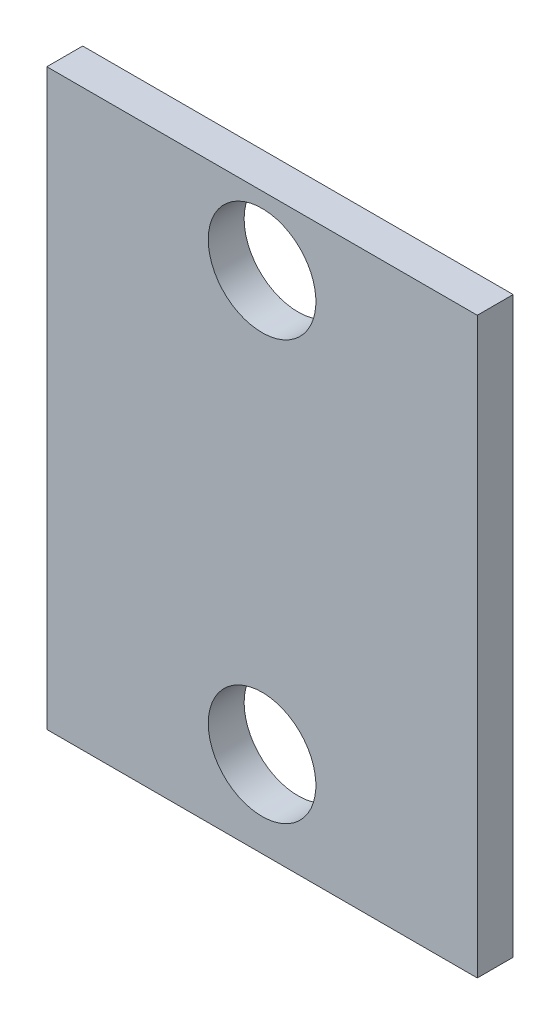
ISO-10303-21;
HEADER;
FILE_DESCRIPTION(('STEP AP214'),'2;1');
FILE_NAME('part.step','',(''),(''),'','','');
FILE_SCHEMA(('AUTOMOTIVE_DESIGN { 1 0 10303 214 1 1 1 1 }'));
ENDSEC;
DATA;
#1=APPLICATION_CONTEXT('core data for automotive mechanical design processes');
#2=APPLICATION_PROTOCOL_DEFINITION('international standard','automotive_design',2000,#1);
#3=PRODUCT_CONTEXT('',#1,'mechanical');
#4=PRODUCT('Part','Part','',(#3));
#5=PRODUCT_RELATED_PRODUCT_CATEGORY('part','',(#4));
#6=PRODUCT_DEFINITION_FORMATION('','',#4);
#7=PRODUCT_DEFINITION_CONTEXT('part definition',#1,'design');
#8=PRODUCT_DEFINITION('design','',#6,#7);
#9=PRODUCT_DEFINITION_SHAPE('','',#8);
#10=(LENGTH_UNIT() NAMED_UNIT(*) SI_UNIT(.MILLI.,.METRE.));
#11=(NAMED_UNIT(*) PLANE_ANGLE_UNIT() SI_UNIT($,.RADIAN.));
#12=(NAMED_UNIT(*) SI_UNIT($,.STERADIAN.) SOLID_ANGLE_UNIT());
#13=UNCERTAINTY_MEASURE_WITH_UNIT(LENGTH_MEASURE(1.E-05),#10,'distance_accuracy_value','');
#14=(GEOMETRIC_REPRESENTATION_CONTEXT(3) GLOBAL_UNCERTAINTY_ASSIGNED_CONTEXT((#13)) GLOBAL_UNIT_ASSIGNED_CONTEXT((#10,
#11,#12)) REPRESENTATION_CONTEXT('',''));
#15=CARTESIAN_POINT('',(0.,0.,0.));
#16=DIRECTION('',(0.,0.,1.));
#17=DIRECTION('',(1.,0.,0.));
#18=AXIS2_PLACEMENT_3D('',#15,#16,#17);
#19=CARTESIAN_POINT('',(0.,0.,1.5875));
#20=DIRECTION('',(1.,0.,0.));
#21=DIRECTION('',(0.,1.,0.));
#22=AXIS2_PLACEMENT_3D('',#19,#20,#21);
#23=PLANE('',#22);
#24=DIRECTION('',(0.,-1.,0.));
#25=VECTOR('',#24,1.);
#26=CARTESIAN_POINT('',(0.,0.,0.));
#27=LINE('',#26,#25);
#28=CARTESIAN_POINT('',(0.,0.,0.));
#29=VERTEX_POINT('',#28);
#30=CARTESIAN_POINT('',(0.,-25.4,0.));
#31=VERTEX_POINT('',#30);
#32=EDGE_CURVE('E107',#29,#31,#27,.T.);
#33=ORIENTED_EDGE('',*,*,#32,.T.);
#34=DIRECTION('',(0.,0.,-1.));
#35=VECTOR('',#34,1.);
#36=CARTESIAN_POINT('',(0.,-25.4,1.5875));
#37=LINE('',#36,#35);
#38=CARTESIAN_POINT('',(0.,-25.4,1.5875));
#39=VERTEX_POINT('',#38);
#40=EDGE_CURVE('E11',#39,#31,#37,.T.);
#41=ORIENTED_EDGE('',*,*,#40,.F.);
#42=DIRECTION('',(0.,-1.,0.));
#43=VECTOR('',#42,1.);
#44=CARTESIAN_POINT('',(0.,0.,1.5875));
#45=LINE('',#44,#43);
#46=CARTESIAN_POINT('',(0.,0.,1.5875));
#47=VERTEX_POINT('',#46);
#48=EDGE_CURVE('E91',#47,#39,#45,.T.);
#49=ORIENTED_EDGE('',*,*,#48,.F.);
#50=DIRECTION('',(0.,0.,-1.));
#51=VECTOR('',#50,1.);
#52=CARTESIAN_POINT('',(0.,0.,1.5875));
#53=LINE('',#52,#51);
#54=EDGE_CURVE('E103',#47,#29,#53,.T.);
#55=ORIENTED_EDGE('',*,*,#54,.T.);
#56=EDGE_LOOP('',(#33,#41,#49,#55));
#57=FACE_BOUND('',#56,.T.);
#58=ADVANCED_FACE('F39',(#57),#23,.F.);
#59=CARTESIAN_POINT('',(0.,-25.4,1.5875));
#60=DIRECTION('',(0.,1.,0.));
#61=DIRECTION('',(0.,0.,1.));
#62=AXIS2_PLACEMENT_3D('',#59,#60,#61);
#63=PLANE('',#62);
#64=DIRECTION('',(1.,0.,0.));
#65=VECTOR('',#64,1.);
#66=CARTESIAN_POINT('',(0.,-25.4,0.));
#67=LINE('',#66,#65);
#68=CARTESIAN_POINT('',(19.05,-25.4,0.));
#69=VERTEX_POINT('',#68);
#70=EDGE_CURVE('E96',#31,#69,#67,.T.);
#71=ORIENTED_EDGE('',*,*,#70,.T.);
#72=DIRECTION('',(0.,0.,-1.));
#73=VECTOR('',#72,1.);
#74=CARTESIAN_POINT('',(19.05,-25.4,1.5875));
#75=LINE('',#74,#73);
#76=CARTESIAN_POINT('',(19.05,-25.4,1.5875));
#77=VERTEX_POINT('',#76);
#78=EDGE_CURVE('E48',#77,#69,#75,.T.);
#79=ORIENTED_EDGE('',*,*,#78,.F.);
#80=DIRECTION('',(1.,0.,0.));
#81=VECTOR('',#80,1.);
#82=CARTESIAN_POINT('',(0.,-25.4,1.5875));
#83=LINE('',#82,#81);
#84=EDGE_CURVE('E86',#39,#77,#83,.T.);
#85=ORIENTED_EDGE('',*,*,#84,.F.);
#86=ORIENTED_EDGE('',*,*,#40,.T.);
#87=EDGE_LOOP('',(#71,#79,#85,#86));
#88=FACE_BOUND('',#87,.T.);
#89=ADVANCED_FACE('F95',(#88),#63,.F.);
#90=CARTESIAN_POINT('',(19.05,0.,1.5875));
#91=DIRECTION('',(-1.,0.,0.));
#92=DIRECTION('',(0.,-1.,0.));
#93=AXIS2_PLACEMENT_3D('',#90,#91,#92);
#94=PLANE('',#93);
#95=DIRECTION('',(0.,1.,0.));
#96=VECTOR('',#95,1.);
#97=CARTESIAN_POINT('',(19.05,0.,0.));
#98=LINE('',#97,#96);
#99=CARTESIAN_POINT('',(19.05,0.,0.));
#100=VERTEX_POINT('',#99);
#101=EDGE_CURVE('E73',#69,#100,#98,.T.);
#102=ORIENTED_EDGE('',*,*,#101,.T.);
#103=DIRECTION('',(0.,0.,-1.));
#104=VECTOR('',#103,1.);
#105=CARTESIAN_POINT('',(19.05,0.,1.5875));
#106=LINE('',#105,#104);
#107=CARTESIAN_POINT('',(19.05,0.,1.5875));
#108=VERTEX_POINT('',#107);
#109=EDGE_CURVE('E98',#108,#100,#106,.T.);
#110=ORIENTED_EDGE('',*,*,#109,.F.);
#111=DIRECTION('',(0.,1.,0.));
#112=VECTOR('',#111,1.);
#113=CARTESIAN_POINT('',(19.05,0.,1.5875));
#114=LINE('',#113,#112);
#115=EDGE_CURVE('E89',#77,#108,#114,.T.);
#116=ORIENTED_EDGE('',*,*,#115,.F.);
#117=ORIENTED_EDGE('',*,*,#78,.T.);
#118=EDGE_LOOP('',(#102,#110,#116,#117));
#119=FACE_BOUND('',#118,.T.);
#120=ADVANCED_FACE('F99',(#119),#94,.F.);
#121=CARTESIAN_POINT('',(0.,0.,1.5875));
#122=DIRECTION('',(0.,-1.,0.));
#123=DIRECTION('',(0.,0.,-1.));
#124=AXIS2_PLACEMENT_3D('',#121,#122,#123);
#125=PLANE('',#124);
#126=DIRECTION('',(-1.,0.,0.));
#127=VECTOR('',#126,1.);
#128=CARTESIAN_POINT('',(0.,0.,0.));
#129=LINE('',#128,#127);
#130=EDGE_CURVE('E79',#100,#29,#129,.T.);
#131=ORIENTED_EDGE('',*,*,#130,.T.);
#132=ORIENTED_EDGE('',*,*,#54,.F.);
#133=DIRECTION('',(-1.,0.,0.));
#134=VECTOR('',#133,1.);
#135=CARTESIAN_POINT('',(0.,0.,1.5875));
#136=LINE('',#135,#134);
#137=EDGE_CURVE('E56',#108,#47,#136,.T.);
#138=ORIENTED_EDGE('',*,*,#137,.F.);
#139=ORIENTED_EDGE('',*,*,#109,.T.);
#140=EDGE_LOOP('',(#131,#132,#138,#139));
#141=FACE_BOUND('',#140,.T.);
#142=ADVANCED_FACE('F121',(#141),#125,.F.);
#143=CARTESIAN_POINT('',(0.,0.,1.5875));
#144=DIRECTION('',(0.,0.,1.));
#145=DIRECTION('',(1.,0.,0.));
#146=AXIS2_PLACEMENT_3D('',#143,#144,#145);
#147=PLANE('',#146);
#148=CARTESIAN_POINT('',(9.525,-3.048,1.5875));
#149=DIRECTION('',(0.,0.,-1.));
#150=DIRECTION('',(-1.,0.,0.));
#151=AXIS2_PLACEMENT_3D('',#148,#149,#150);
#152=CIRCLE('',#151,2.38125);
#153=CARTESIAN_POINT('',(7.14375,-3.048,1.5875));
#154=VERTEX_POINT('',#153);
#155=EDGE_CURVE('E135',#154,#154,#152,.T.);
#156=ORIENTED_EDGE('',*,*,#155,.T.);
#157=EDGE_LOOP('',(#156));
#158=FACE_BOUND('',#157,.T.);
#159=CARTESIAN_POINT('',(9.525,-21.59,1.5875));
#160=DIRECTION('',(0.,0.,-1.));
#161=DIRECTION('',(-1.,0.,0.));
#162=AXIS2_PLACEMENT_3D('',#159,#160,#161);
#163=CIRCLE('',#162,2.38125);
#164=CARTESIAN_POINT('',(7.14375,-21.59,1.5875));
#165=VERTEX_POINT('',#164);
#166=EDGE_CURVE('E111',#165,#165,#163,.T.);
#167=ORIENTED_EDGE('',*,*,#166,.T.);
#168=EDGE_LOOP('',(#167));
#169=FACE_BOUND('',#168,.T.);
#170=ORIENTED_EDGE('',*,*,#48,.T.);
#171=ORIENTED_EDGE('',*,*,#84,.T.);
#172=ORIENTED_EDGE('',*,*,#115,.T.);
#173=ORIENTED_EDGE('',*,*,#137,.T.);
#174=EDGE_LOOP('',(#170,#171,#172,#173));
#175=FACE_BOUND('',#174,.T.);
#176=ADVANCED_FACE('F87',(#158,#169,#175),#147,.T.);
#177=CARTESIAN_POINT('',(0.,0.,0.));
#178=DIRECTION('',(0.,0.,1.));
#179=DIRECTION('',(1.,0.,0.));
#180=AXIS2_PLACEMENT_3D('',#177,#178,#179);
#181=PLANE('',#180);
#182=CARTESIAN_POINT('',(9.525,-3.048,0.));
#183=DIRECTION('',(0.,0.,-1.));
#184=DIRECTION('',(-1.,0.,0.));
#185=AXIS2_PLACEMENT_3D('',#182,#183,#184);
#186=CIRCLE('',#185,2.38124999999999);
#187=CARTESIAN_POINT('',(7.14375000000001,-3.048,0.));
#188=VERTEX_POINT('',#187);
#189=EDGE_CURVE('E139',#188,#188,#186,.T.);
#190=ORIENTED_EDGE('',*,*,#189,.F.);
#191=EDGE_LOOP('',(#190));
#192=FACE_BOUND('',#191,.T.);
#193=CARTESIAN_POINT('',(9.525,-21.59,0.));
#194=DIRECTION('',(0.,0.,-1.));
#195=DIRECTION('',(-1.,0.,0.));
#196=AXIS2_PLACEMENT_3D('',#193,#194,#195);
#197=CIRCLE('',#196,2.38124999999999);
#198=CARTESIAN_POINT('',(7.14375000000002,-21.59,0.));
#199=VERTEX_POINT('',#198);
#200=EDGE_CURVE('E131',#199,#199,#197,.T.);
#201=ORIENTED_EDGE('',*,*,#200,.F.);
#202=EDGE_LOOP('',(#201));
#203=FACE_BOUND('',#202,.T.);
#204=ORIENTED_EDGE('',*,*,#32,.F.);
#205=ORIENTED_EDGE('',*,*,#130,.F.);
#206=ORIENTED_EDGE('',*,*,#101,.F.);
#207=ORIENTED_EDGE('',*,*,#70,.F.);
#208=EDGE_LOOP('',(#204,#205,#206,#207));
#209=FACE_BOUND('',#208,.T.);
#210=ADVANCED_FACE('F124',(#192,#203,#209),#181,.F.);
#211=CARTESIAN_POINT('',(9.525,-21.59,0.));
#212=DIRECTION('',(0.,0.,-1.));
#213=DIRECTION('',(-1.,0.,0.));
#214=AXIS2_PLACEMENT_3D('',#211,#212,#213);
#215=CYLINDRICAL_SURFACE('',#214,2.38124999999999);
#216=ORIENTED_EDGE('',*,*,#166,.F.);
#217=EDGE_LOOP('',(#216));
#218=FACE_BOUND('',#217,.T.);
#219=ORIENTED_EDGE('',*,*,#200,.T.);
#220=EDGE_LOOP('',(#219));
#221=FACE_BOUND('',#220,.T.);
#222=ADVANCED_FACE('F148',(#218,#221),#215,.F.);
#223=CARTESIAN_POINT('',(9.525,-3.048,0.));
#224=DIRECTION('',(0.,0.,-1.));
#225=DIRECTION('',(-1.,0.,0.));
#226=AXIS2_PLACEMENT_3D('',#223,#224,#225);
#227=CYLINDRICAL_SURFACE('',#226,2.38124999999999);
#228=ORIENTED_EDGE('',*,*,#155,.F.);
#229=EDGE_LOOP('',(#228));
#230=FACE_BOUND('',#229,.T.);
#231=ORIENTED_EDGE('',*,*,#189,.T.);
#232=EDGE_LOOP('',(#231));
#233=FACE_BOUND('',#232,.T.);
#234=ADVANCED_FACE('F144',(#230,#233),#227,.F.);
#235=CLOSED_SHELL('',(#58,#89,#120,#142,#176,#210,#222,#234));
#236=MANIFOLD_SOLID_BREP('B2',#235);
#237=ADVANCED_BREP_SHAPE_REPRESENTATION('',(#18,#236),#14);
#238=SHAPE_DEFINITION_REPRESENTATION(#9,#237);
ENDSEC;
END-ISO-10303-21;
